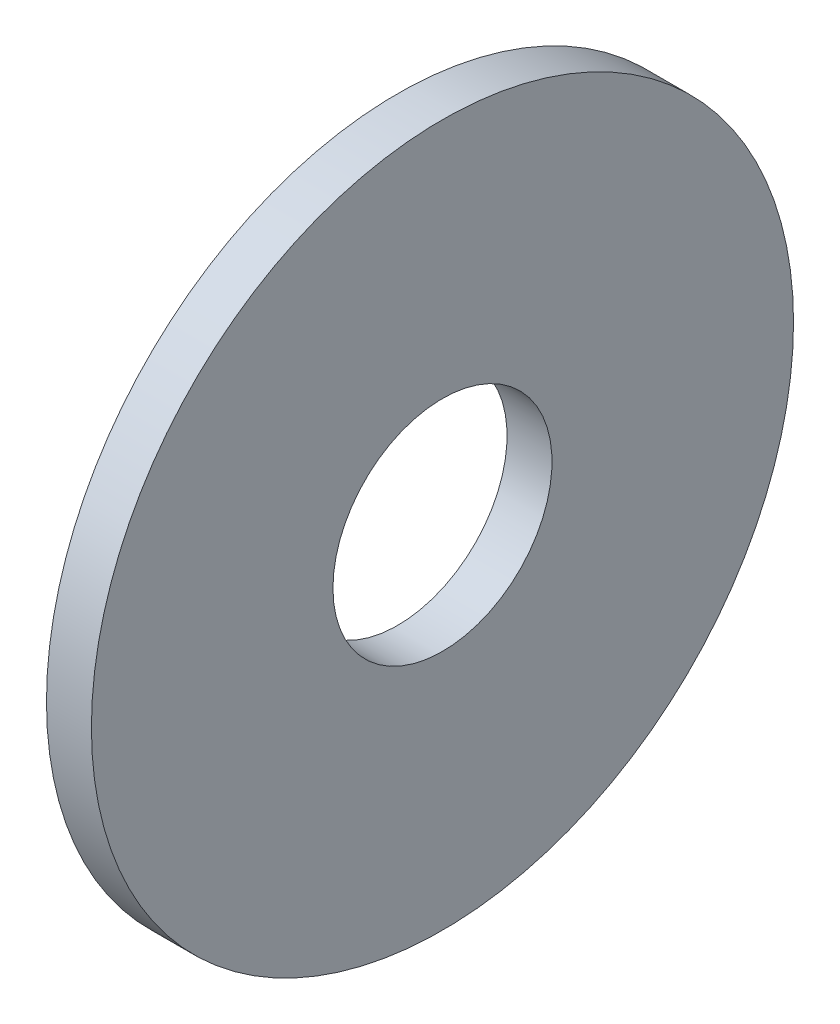
ISO-10303-21;
HEADER;
FILE_DESCRIPTION(('STEP AP214'),'2;1');
FILE_NAME('part.step','',(''),(''),'','','');
FILE_SCHEMA(('AUTOMOTIVE_DESIGN { 1 0 10303 214 1 1 1 1 }'));
ENDSEC;
DATA;
#1=APPLICATION_CONTEXT('core data for automotive mechanical design processes');
#2=APPLICATION_PROTOCOL_DEFINITION('international standard','automotive_design',2000,#1);
#3=PRODUCT_CONTEXT('',#1,'mechanical');
#4=PRODUCT('Part','Part','',(#3));
#5=PRODUCT_RELATED_PRODUCT_CATEGORY('part','',(#4));
#6=PRODUCT_DEFINITION_FORMATION('','',#4);
#7=PRODUCT_DEFINITION_CONTEXT('part definition',#1,'design');
#8=PRODUCT_DEFINITION('design','',#6,#7);
#9=PRODUCT_DEFINITION_SHAPE('','',#8);
#10=(LENGTH_UNIT() NAMED_UNIT(*) SI_UNIT(.MILLI.,.METRE.));
#11=(NAMED_UNIT(*) PLANE_ANGLE_UNIT() SI_UNIT($,.RADIAN.));
#12=(NAMED_UNIT(*) SI_UNIT($,.STERADIAN.) SOLID_ANGLE_UNIT());
#13=UNCERTAINTY_MEASURE_WITH_UNIT(LENGTH_MEASURE(1.E-05),#10,'distance_accuracy_value','');
#14=(GEOMETRIC_REPRESENTATION_CONTEXT(3) GLOBAL_UNCERTAINTY_ASSIGNED_CONTEXT((#13)) GLOBAL_UNIT_ASSIGNED_CONTEXT((#10,
#11,#12)) REPRESENTATION_CONTEXT('',''));
#15=CARTESIAN_POINT('',(0.,0.,0.));
#16=DIRECTION('',(0.,0.,1.));
#17=DIRECTION('',(1.,0.,0.));
#18=AXIS2_PLACEMENT_3D('',#15,#16,#17);
#19=CARTESIAN_POINT('',(-34.9249999999999,0.,0.));
#20=DIRECTION('',(-1.,0.,0.));
#21=DIRECTION('',(0.,0.,1.));
#22=AXIS2_PLACEMENT_3D('',#19,#20,#21);
#23=CYLINDRICAL_SURFACE('',#22,19.5);
#24=CARTESIAN_POINT('',(0.,0.,0.));
#25=DIRECTION('',(-1.,0.,0.));
#26=DIRECTION('',(0.,0.,1.));
#27=AXIS2_PLACEMENT_3D('',#24,#25,#26);
#28=CIRCLE('',#27,19.5);
#29=CARTESIAN_POINT('',(0.,0.,19.5));
#30=VERTEX_POINT('',#29);
#31=EDGE_CURVE('E10',#30,#30,#28,.T.);
#32=ORIENTED_EDGE('',*,*,#31,.F.);
#33=EDGE_LOOP('',(#32));
#34=FACE_BOUND('',#33,.T.);
#35=CARTESIAN_POINT('',(-8.,0.,0.));
#36=DIRECTION('',(-1.,0.,0.));
#37=DIRECTION('',(0.,0.,1.));
#38=AXIS2_PLACEMENT_3D('',#35,#36,#37);
#39=CIRCLE('',#38,19.5);
#40=CARTESIAN_POINT('',(-8.,0.,19.5));
#41=VERTEX_POINT('',#40);
#42=EDGE_CURVE('E44',#41,#41,#39,.T.);
#43=ORIENTED_EDGE('',*,*,#42,.T.);
#44=EDGE_LOOP('',(#43));
#45=FACE_BOUND('',#44,.T.);
#46=ADVANCED_FACE('F30',(#34,#45),#23,.F.);
#47=CARTESIAN_POINT('',(0.,19.5,0.));
#48=DIRECTION('',(-1.,0.,0.));
#49=DIRECTION('',(0.,0.,1.));
#50=AXIS2_PLACEMENT_3D('',#47,#48,#49);
#51=PLANE('',#50);
#52=CARTESIAN_POINT('',(0.,0.,0.));
#53=DIRECTION('',(-1.,0.,0.));
#54=DIRECTION('',(0.,0.,1.));
#55=AXIS2_PLACEMENT_3D('',#52,#53,#54);
#56=CIRCLE('',#55,62.5);
#57=CARTESIAN_POINT('',(0.,0.,62.5));
#58=VERTEX_POINT('',#57);
#59=EDGE_CURVE('E36',#58,#58,#56,.T.);
#60=ORIENTED_EDGE('',*,*,#59,.F.);
#61=EDGE_LOOP('',(#60));
#62=FACE_BOUND('',#61,.T.);
#63=ORIENTED_EDGE('',*,*,#31,.T.);
#64=EDGE_LOOP('',(#63));
#65=FACE_BOUND('',#64,.T.);
#66=ADVANCED_FACE('F59',(#62,#65),#51,.F.);
#67=CARTESIAN_POINT('',(-34.9249999999999,0.,0.));
#68=DIRECTION('',(-1.,0.,0.));
#69=DIRECTION('',(0.,0.,1.));
#70=AXIS2_PLACEMENT_3D('',#67,#68,#69);
#71=CYLINDRICAL_SURFACE('',#70,62.5);
#72=CARTESIAN_POINT('',(-8.,0.,0.));
#73=DIRECTION('',(-1.,0.,0.));
#74=DIRECTION('',(0.,0.,1.));
#75=AXIS2_PLACEMENT_3D('',#72,#73,#74);
#76=CIRCLE('',#75,62.5);
#77=CARTESIAN_POINT('',(-8.,0.,62.5));
#78=VERTEX_POINT('',#77);
#79=EDGE_CURVE('E40',#78,#78,#76,.T.);
#80=ORIENTED_EDGE('',*,*,#79,.F.);
#81=EDGE_LOOP('',(#80));
#82=FACE_BOUND('',#81,.T.);
#83=ORIENTED_EDGE('',*,*,#59,.T.);
#84=EDGE_LOOP('',(#83));
#85=FACE_BOUND('',#84,.T.);
#86=ADVANCED_FACE('F54',(#82,#85),#71,.T.);
#87=CARTESIAN_POINT('',(-8.,62.5,0.));
#88=DIRECTION('',(1.,0.,0.));
#89=DIRECTION('',(0.,0.,-1.));
#90=AXIS2_PLACEMENT_3D('',#87,#88,#89);
#91=PLANE('',#90);
#92=ORIENTED_EDGE('',*,*,#42,.F.);
#93=EDGE_LOOP('',(#92));
#94=FACE_BOUND('',#93,.T.);
#95=ORIENTED_EDGE('',*,*,#79,.T.);
#96=EDGE_LOOP('',(#95));
#97=FACE_BOUND('',#96,.T.);
#98=ADVANCED_FACE('F51',(#94,#97),#91,.F.);
#99=CLOSED_SHELL('',(#46,#66,#86,#98));
#100=MANIFOLD_SOLID_BREP('B2',#99);
#101=ADVANCED_BREP_SHAPE_REPRESENTATION('',(#18,#100),#14);
#102=SHAPE_DEFINITION_REPRESENTATION(#9,#101);
ENDSEC;
END-ISO-10303-21;
